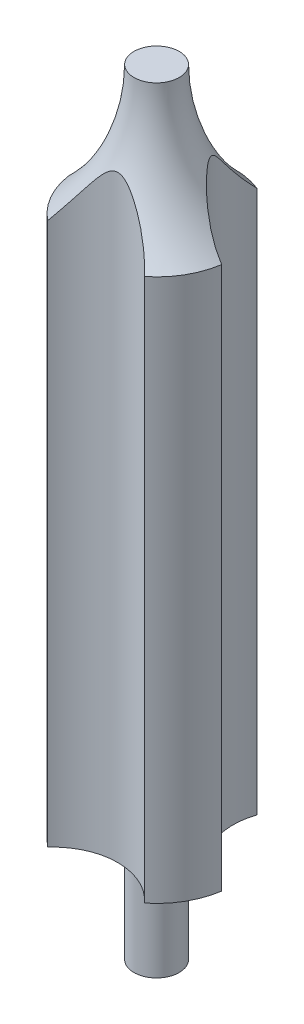
ISO-10303-21;
HEADER;
FILE_DESCRIPTION(('STEP AP214'),'2;1');
FILE_NAME('part.step','',(''),(''),'','','');
FILE_SCHEMA(('AUTOMOTIVE_DESIGN { 1 0 10303 214 1 1 1 1 }'));
ENDSEC;
DATA;
#1=APPLICATION_CONTEXT('core data for automotive mechanical design processes');
#2=APPLICATION_PROTOCOL_DEFINITION('international standard','automotive_design',2000,#1);
#3=PRODUCT_CONTEXT('',#1,'mechanical');
#4=PRODUCT('Part','Part','',(#3));
#5=PRODUCT_RELATED_PRODUCT_CATEGORY('part','',(#4));
#6=PRODUCT_DEFINITION_FORMATION('','',#4);
#7=PRODUCT_DEFINITION_CONTEXT('part definition',#1,'design');
#8=PRODUCT_DEFINITION('design','',#6,#7);
#9=PRODUCT_DEFINITION_SHAPE('','',#8);
#10=(LENGTH_UNIT() NAMED_UNIT(*) SI_UNIT(.MILLI.,.METRE.));
#11=(NAMED_UNIT(*) PLANE_ANGLE_UNIT() SI_UNIT($,.RADIAN.));
#12=(NAMED_UNIT(*) SI_UNIT($,.STERADIAN.) SOLID_ANGLE_UNIT());
#13=UNCERTAINTY_MEASURE_WITH_UNIT(LENGTH_MEASURE(1.E-05),#10,'distance_accuracy_value','');
#14=(GEOMETRIC_REPRESENTATION_CONTEXT(3) GLOBAL_UNCERTAINTY_ASSIGNED_CONTEXT((#13)) GLOBAL_UNIT_ASSIGNED_CONTEXT((#10,
#11,#12)) REPRESENTATION_CONTEXT('',''));
#15=CARTESIAN_POINT('',(0.,0.,0.));
#16=DIRECTION('',(0.,0.,1.));
#17=DIRECTION('',(1.,0.,0.));
#18=AXIS2_PLACEMENT_3D('',#15,#16,#17);
#19=CARTESIAN_POINT('',(0.,18.1736311229692,0.));
#20=DIRECTION('',(0.,1.,0.));
#21=DIRECTION('',(-1.,0.,0.));
#22=AXIS2_PLACEMENT_3D('',#19,#20,#21);
#23=CYLINDRICAL_SURFACE('',#22,3.);
#24=DIRECTION('',(0.,1.,0.));
#25=VECTOR('',#24,1.);
#26=CARTESIAN_POINT('',(1.87265478332233,3.17363712296916,2.34375));
#27=LINE('',#26,#25);
#28=CARTESIAN_POINT('',(1.87265478332233,-7.82636887703084,2.34375));
#29=VERTEX_POINT('',#28);
#30=CARTESIAN_POINT('',(1.87265478332233,13.1736311229692,2.34375));
#31=VERTEX_POINT('',#30);
#32=EDGE_CURVE('E130',#29,#31,#27,.T.);
#33=ORIENTED_EDGE('',*,*,#32,.F.);
#34=CARTESIAN_POINT('',(0.,-7.82636887703084,0.));
#35=DIRECTION('',(0.,1.,0.));
#36=DIRECTION('',(-1.,0.,0.));
#37=AXIS2_PLACEMENT_3D('',#34,#35,#36);
#38=CIRCLE('',#37,3.);
#39=CARTESIAN_POINT('',(2.96607443178095,-7.82636887703084,0.449891614875567));
#40=VERTEX_POINT('',#39);
#41=EDGE_CURVE('E115',#29,#40,#38,.T.);
#42=ORIENTED_EDGE('',*,*,#41,.T.);
#43=DIRECTION('',(0.,1.,0.));
#44=VECTOR('',#43,1.);
#45=CARTESIAN_POINT('',(2.96607443178095,3.17363712296916,0.449891614875567));
#46=LINE('',#45,#44);
#47=CARTESIAN_POINT('',(2.96607443178094,13.1736311229692,0.449891614875567));
#48=VERTEX_POINT('',#47);
#49=EDGE_CURVE('E60',#48,#40,#46,.F.);
#50=ORIENTED_EDGE('',*,*,#49,.F.);
#51=CARTESIAN_POINT('',(0.,13.1736311229692,0.));
#52=DIRECTION('',(0.,1.,0.));
#53=DIRECTION('',(-1.,0.,0.));
#54=AXIS2_PLACEMENT_3D('',#51,#52,#53);
#55=CIRCLE('',#54,3.);
#56=EDGE_CURVE('E119',#31,#48,#55,.T.);
#57=ORIENTED_EDGE('',*,*,#56,.F.);
#58=EDGE_LOOP('',(#33,#42,#50,#57));
#59=FACE_BOUND('',#58,.T.);
#60=ADVANCED_FACE('F37',(#59),#23,.T.);
#61=DIRECTION('',(0.,1.,0.));
#62=VECTOR('',#61,1.);
#63=CARTESIAN_POINT('',(1.0934196484586,3.17363712296916,-2.79364161487559));
#64=LINE('',#63,#62);
#65=CARTESIAN_POINT('',(1.0934196484586,-7.82636887703084,-2.79364161487559));
#66=VERTEX_POINT('',#65);
#67=CARTESIAN_POINT('',(1.0934196484586,13.1736311229692,-2.79364161487559));
#68=VERTEX_POINT('',#67);
#69=EDGE_CURVE('E163',#66,#68,#64,.T.);
#70=ORIENTED_EDGE('',*,*,#69,.F.);
#71=CARTESIAN_POINT('',(-1.09341964845862,-7.82636887703084,-2.79364161487558));
#72=VERTEX_POINT('',#71);
#73=EDGE_CURVE('E117',#66,#72,#38,.T.);
#74=ORIENTED_EDGE('',*,*,#73,.T.);
#75=DIRECTION('',(0.,1.,0.));
#76=VECTOR('',#75,1.);
#77=CARTESIAN_POINT('',(-1.09341964845862,3.17363712296916,-2.79364161487558));
#78=LINE('',#77,#76);
#79=CARTESIAN_POINT('',(-1.09341964845862,13.1736311229692,-2.79364161487558));
#80=VERTEX_POINT('',#79);
#81=EDGE_CURVE('E52',#80,#72,#78,.F.);
#82=ORIENTED_EDGE('',*,*,#81,.F.);
#83=EDGE_CURVE('E114',#68,#80,#55,.T.);
#84=ORIENTED_EDGE('',*,*,#83,.F.);
#85=EDGE_LOOP('',(#70,#74,#82,#84));
#86=FACE_BOUND('',#85,.T.);
#87=ADVANCED_FACE('F196',(#86),#23,.T.);
#88=CARTESIAN_POINT('',(0.,18.1736311229692,0.));
#89=DIRECTION('',(0.,1.,0.));
#90=DIRECTION('',(-1.,0.,0.));
#91=AXIS2_PLACEMENT_3D('',#88,#89,#90);
#92=CYLINDRICAL_SURFACE('',#91,0.875000000000003);
#93=CARTESIAN_POINT('',(0.,-11.8263688770308,0.));
#94=DIRECTION('',(0.,1.,0.));
#95=DIRECTION('',(-1.,0.,0.));
#96=AXIS2_PLACEMENT_3D('',#93,#94,#95);
#97=CIRCLE('',#96,0.875);
#98=CARTESIAN_POINT('',(-0.874999999999996,-11.8263688770308,0.));
#99=VERTEX_POINT('',#98);
#100=EDGE_CURVE('E97',#99,#99,#97,.T.);
#101=ORIENTED_EDGE('',*,*,#100,.T.);
#102=EDGE_LOOP('',(#101));
#103=FACE_BOUND('',#102,.T.);
#104=CARTESIAN_POINT('',(0.,-7.82636887703084,0.));
#105=DIRECTION('',(0.,1.,0.));
#106=DIRECTION('',(-1.,0.,0.));
#107=AXIS2_PLACEMENT_3D('',#104,#105,#106);
#108=CIRCLE('',#107,0.875000000000005);
#109=CARTESIAN_POINT('',(-0.875000000000002,-7.82636887703084,0.));
#110=VERTEX_POINT('',#109);
#111=EDGE_CURVE('E123',#110,#110,#108,.T.);
#112=ORIENTED_EDGE('',*,*,#111,.F.);
#113=EDGE_LOOP('',(#112));
#114=FACE_BOUND('',#113,.T.);
#115=ADVANCED_FACE('F200',(#103,#114),#92,.T.);
#116=CARTESIAN_POINT('',(0.,-11.8263688770308,0.));
#117=DIRECTION('',(0.,-1.,0.));
#118=DIRECTION('',(1.,0.,0.));
#119=AXIS2_PLACEMENT_3D('',#116,#117,#118);
#120=PLANE('',#119);
#121=CARTESIAN_POINT('',(0.,-11.8263688770308,0.));
#122=DIRECTION('',(0.,-1.,0.));
#123=DIRECTION('',(1.,0.,0.));
#124=AXIS2_PLACEMENT_3D('',#121,#122,#123);
#125=CIRCLE('',#124,0.5);
#126=CARTESIAN_POINT('',(0.500000000000002,-11.8263688770308,0.));
#127=VERTEX_POINT('',#126);
#128=EDGE_CURVE('E302',#127,#127,#125,.T.);
#129=ORIENTED_EDGE('',*,*,#128,.F.);
#130=EDGE_LOOP('',(#129));
#131=FACE_BOUND('',#130,.T.);
#132=ORIENTED_EDGE('',*,*,#100,.F.);
#133=EDGE_LOOP('',(#132));
#134=FACE_BOUND('',#133,.T.);
#135=ADVANCED_FACE('F211',(#131,#134),#120,.T.);
#136=CARTESIAN_POINT('',(0.,18.1736311229692,0.));
#137=DIRECTION('',(0.,1.,0.));
#138=DIRECTION('',(-1.,0.,0.));
#139=AXIS2_PLACEMENT_3D('',#136,#137,#138);
#140=PLANE('',#139);
#141=CARTESIAN_POINT('',(0.,18.1736311229692,0.));
#142=DIRECTION('',(0.,1.,0.));
#143=DIRECTION('',(-1.,0.,0.));
#144=AXIS2_PLACEMENT_3D('',#141,#142,#143);
#145=CIRCLE('',#144,0.875);
#146=CARTESIAN_POINT('',(-0.875000000000002,18.1736311229692,0.));
#147=VERTEX_POINT('',#146);
#148=EDGE_CURVE('E176',#147,#147,#145,.T.);
#149=ORIENTED_EDGE('',*,*,#148,.T.);
#150=EDGE_LOOP('',(#149));
#151=FACE_BOUND('',#150,.T.);
#152=ADVANCED_FACE('F206',(#151),#140,.T.);
#153=CARTESIAN_POINT('',(0.,18.1970519709332,0.));
#154=DIRECTION('',(0.,1.,0.));
#155=DIRECTION('',(-1.,0.,0.));
#156=AXIS2_PLACEMENT_3D('',#153,#154,#155);
#157=TOROIDAL_SURFACE('',#156,7.87496081873896,7.);
#158=ORIENTED_EDGE('',*,*,#148,.F.);
#159=EDGE_LOOP('',(#158));
#160=FACE_BOUND('',#159,.T.);
#161=CARTESIAN_POINT('',(-2.96607443178094,13.1736311229692,0.449891614875589));
#162=VERTEX_POINT('',#161);
#163=CARTESIAN_POINT('',(-1.87265478332233,13.1736311229692,2.34375));
#164=VERTEX_POINT('',#163);
#165=EDGE_CURVE('E106',#162,#164,#55,.T.);
#166=ORIENTED_EDGE('',*,*,#165,.T.);
#167=CARTESIAN_POINT('',(-1.87279148834935,13.1734311229691,2.34390457969166));
#168=CARTESIAN_POINT('',(-1.84168791419111,13.2189297558518,2.30873395479843));
#169=CARTESIAN_POINT('',(-1.81000695040931,13.2650455516065,2.27490072332095));
#170=CARTESIAN_POINT('',(-1.74567385393712,13.3583895636435,2.20982773387895));
#171=CARTESIAN_POINT('',(-1.71302202254241,13.4056174338809,2.17858718248888));
#172=CARTESIAN_POINT('',(-1.61396895890166,13.5486661127812,2.08870384040498));
#173=CARTESIAN_POINT('',(-1.54636290678259,13.6460078763119,2.03378007268825));
#174=CARTESIAN_POINT('',(-1.40965214341558,13.8425581428202,1.93360590310212));
#175=CARTESIAN_POINT('',(-1.34057298818892,13.9417331374487,1.88825323730042));
#176=CARTESIAN_POINT('',(-1.20033983089158,14.1419306220951,1.80549989897855));
#177=CARTESIAN_POINT('',(-1.12918550631041,14.2429533983649,1.76810047007298));
#178=CARTESIAN_POINT('',(-1.01679054306838,14.3995229453104,1.71569383480251));
#179=CARTESIAN_POINT('',(-0.976565468611379,14.4549862632391,1.69820601001453));
#180=CARTESIAN_POINT('',(-0.894867987468231,14.5656147108565,1.66522879217567));
#181=CARTESIAN_POINT('',(-0.853395325487044,14.6207797767513,1.64973981162791));
#182=CARTESIAN_POINT('',(-0.768301017183521,14.7306469562195,1.620556063431));
#183=CARTESIAN_POINT('',(-0.724664974101493,14.785341962385,1.60687644777913));
#184=CARTESIAN_POINT('',(-0.634582907108512,14.8928051164561,1.58142476962931));
#185=CARTESIAN_POINT('',(-0.588139613257608,14.9455750588673,1.56965089351742));
#186=CARTESIAN_POINT('',(-0.514634774664298,15.0221542495483,1.55341310490626));
#187=CARTESIAN_POINT('',(-0.489282976047146,15.0474355612788,1.54820326081601));
#188=CARTESIAN_POINT('',(-0.437034188987936,15.096452918467,1.53835227399683));
#189=CARTESIAN_POINT('',(-0.410138273502746,15.1201900130611,1.53371074322578));
#190=CARTESIAN_POINT('',(-0.354642994173274,15.1651184886637,1.52512444596546));
#191=CARTESIAN_POINT('',(-0.326064787487499,15.1863342576709,1.52117279463073));
#192=CARTESIAN_POINT('',(-0.266534578162435,15.2252164360391,1.51406880083951));
#193=CARTESIAN_POINT('',(-0.23559018110598,15.2428936072494,1.51091402695249));
#194=CARTESIAN_POINT('',(-0.17791328759288,15.2696214335115,1.50620891651343));
#195=CARTESIAN_POINT('',(-0.151690159942641,15.2797078552677,1.50445988894649));
#196=CARTESIAN_POINT('',(-0.0978753847906424,15.295303226175,1.50177228962354));
#197=CARTESIAN_POINT('',(-0.0702866332103793,15.3008214560549,1.5008320745329));
#198=CARTESIAN_POINT('',(-0.0142754136517339,15.3063914931008,1.49988304948893));
#199=CARTESIAN_POINT('',(0.0141521985218801,15.3063956526008,1.49988235805775));
#200=CARTESIAN_POINT('',(0.0704498109312545,15.3008133342423,1.50083344207367));
#201=CARTESIAN_POINT('',(0.0983188401450211,15.2952178590679,1.50178675037733));
#202=CARTESIAN_POINT('',(0.157689011387603,15.2779166984957,1.50476886190062));
#203=CARTESIAN_POINT('',(0.188895323823397,15.2652643781759,1.50696539163204));
#204=CARTESIAN_POINT('',(0.248964668580153,15.2354399211681,1.51224364179743));
#205=CARTESIAN_POINT('',(0.27782182998572,15.2182568894852,1.51532749763662));
#206=CARTESIAN_POINT('',(0.343099508395626,15.1744527336863,1.5233669015715));
#207=CARTESIAN_POINT('',(0.378659481738859,15.1466276594519,1.52860037786691));
#208=CARTESIAN_POINT('',(0.446970036598267,15.0878564145683,1.54003714379264));
#209=CARTESIAN_POINT('',(0.479713858166411,15.0569031016983,1.54624267135285));
#210=CARTESIAN_POINT('',(0.543372211513685,14.992869315235,1.55954697991969));
#211=CARTESIAN_POINT('',(0.574270028742408,14.9597738160309,1.56665250461273));
#212=CARTESIAN_POINT('',(0.634487622041539,14.8924300877752,1.5816565568887));
#213=CARTESIAN_POINT('',(0.663809006819957,14.8581830941369,1.58955425154873));
#214=CARTESIAN_POINT('',(0.74069092193397,14.7656302581617,1.6117175403507));
#215=CARTESIAN_POINT('',(0.787236828645713,14.706653676925,1.62668981569411));
#216=CARTESIAN_POINT('',(0.878368721870609,14.587796380378,1.65888995012411));
#217=CARTESIAN_POINT('',(0.922954013245691,14.5279153543455,1.67611860073399));
#218=CARTESIAN_POINT('',(1.01086746144209,14.4078322342218,1.71298837204648));
#219=CARTESIAN_POINT('',(1.05419373970759,14.347629804574,1.73263288973361));
#220=CARTESIAN_POINT('',(1.1398857145546,14.2274304255917,1.77448214045318));
#221=CARTESIAN_POINT('',(1.1822513482308,14.1674334899305,1.79668704056956));
#222=CARTESIAN_POINT('',(1.30764317891457,13.9890505062309,1.86710417951834));
#223=CARTESIAN_POINT('',(1.38955797520291,13.87144255783,1.91936591252555));
#224=CARTESIAN_POINT('',(1.55024108244964,13.6404360226971,2.03618336990147));
#225=CARTESIAN_POINT('',(1.62901386697639,13.5270314687758,2.10072080099379));
#226=CARTESIAN_POINT('',(1.7340748231391,13.3751582296195,2.19874760957119));
#227=CARTESIAN_POINT('',(1.76234208439822,13.3342305517134,2.22637472717458));
#228=CARTESIAN_POINT('',(1.81815086128756,13.2531893028696,2.28362953238699));
#229=CARTESIAN_POINT('',(1.84569141871069,13.2130768214067,2.31325969416506));
#230=CARTESIAN_POINT('',(1.87279148834934,13.1734311229691,2.34390457969166));
#231=B_SPLINE_CURVE_WITH_KNOTS('',3,(#167,#168,#169,#170,#171,#172,#173,#174,#175,#176,#177,
#178,#179,#180,#181,#182,#183,#184,#185,#186,#187,#188,#189,#190,#191,#192,#193,#194,#195,#196,
#197,#198,#199,#200,#201,#202,#203,#204,#205,#206,#207,#208,#209,#210,#211,#212,#213,#214,#215,
#216,#217,#218,#219,#220,#221,#222,#223,#224,#225,#226,#227,#228,#229,#230),.UNSPECIFIED.,.F.,
.F.,(4,2,2,2,2,2,2,2,2,2,2,2,2,2,2,2,2,2,2,2,2,2,2,2,2,2,2,2,2,2,2,4),(0.,0.196094940739122,
0.392129648475782,0.78353039750454,1.17050979811252,1.55754966466079,1.7696538430935,
1.98180172387871,2.19562672240946,2.40924702062951,2.51773921319612,2.62615690965359,
2.73342163296364,2.84035500561147,2.92448075833779,3.00843517900155,3.09311505401682,
3.17793120878399,3.27860152040101,3.37951615721427,3.51553194432585,3.65186560883774,
3.78928905196963,3.92656948717997,4.15629823291934,4.38610778310565,4.61624424788762,
4.84639573928839,5.30355716395833,5.76004258850016,5.93069776854791,6.10156773653594),.UNSPECIFIED.);
#232=EDGE_CURVE('E127',#164,#31,#231,.T.);
#233=ORIENTED_EDGE('',*,*,#232,.T.);
#234=ORIENTED_EDGE('',*,*,#56,.T.);
#235=CARTESIAN_POINT('',(2.96627665423432,13.1734311229692,0.449932715055951));
#236=CARTESIAN_POINT('',(2.92026621253069,13.2189297558519,0.440581542133034));
#237=CARTESIAN_POINT('',(2.87512529268817,13.2650455516066,0.430061638420365));
#238=CARTESIAN_POINT('',(2.7866038824951,13.3583895636435,0.406884037292332));
#239=CARTESIAN_POINT('',(2.74322285566572,13.405617433881,0.39422699751946));
#240=CARTESIAN_POINT('',(2.61585506622363,13.5486661127813,0.353386199125846));
#241=CARTESIAN_POINT('',(2.53448666204986,13.6460078763119,0.322299524399521));
#242=CARTESIAN_POINT('',(2.37937790470175,13.8425581428203,0.253991615145989));
#243=CARTESIAN_POINT('',(2.30556176637481,13.9417331374487,0.216843644748585));
#244=CARTESIAN_POINT('',(2.16377869449143,14.1419306220951,0.136774837237122));
#245=CARTESIAN_POINT('',(2.09581267668159,14.242953398365,0.0938530990134838));
#246=CARTESIAN_POINT('',(1.99422971758948,14.3995229453104,0.022719523223714));
#247=CARTESIAN_POINT('',(1.95897227983766,14.4549862632391,-0.00337250073118608));
#248=CARTESIAN_POINT('',(1.8895644308715,14.5656147108565,-0.0576359859069207));
#249=CARTESIAN_POINT('',(1.85541424924782,14.6207797767514,-0.0858078744713134));
#250=CARTESIAN_POINT('',(1.78759322777989,14.7306469562195,-0.144909833081177));
#251=CARTESIAN_POINT('',(1.75392831157035,14.785341962385,-0.17585994708491));
#252=CARTESIAN_POINT('',(1.68684547822716,14.8928051164561,-0.241147466451337));
#253=CARTESIAN_POINT('',(1.65342735548781,14.9455750588674,-0.275481600705705));
#254=CARTESIAN_POINT('',(1.6026125987526,15.0221542495484,-0.331019763923007));
#255=CARTESIAN_POINT('',(1.58542484211211,15.0474355612789,-0.350370143511959));
#256=CARTESIAN_POINT('',(1.55076924374475,15.096452918467,-0.390693427012572));
#257=CARTESIAN_POINT('',(1.53330160244198,15.1201900130611,-0.411665207695265));
#258=CARTESIAN_POINT('',(1.49811801122536,15.1651184886637,-0.455432380754541));
#259=CARTESIAN_POINT('',(1.48040667743969,15.1863342576709,-0.478206008071661));
#260=CARTESIAN_POINT('',(1.44448933368564,15.2252164360391,-0.526208684744167));
#261=CARTESIAN_POINT('',(1.42628502082806,15.2428936072494,-0.551429931756344));
#262=CARTESIAN_POINT('',(1.39337182890367,15.2696214335115,-0.599027031530531));
#263=CARTESIAN_POINT('',(1.37874556277366,15.2797078552677,-0.620862412458847));
#264=CARTESIAN_POINT('',(1.34951064590879,15.2953032261751,-0.666123575177955));
#265=CARTESIAN_POINT('',(1.33490201996514,15.3008214560549,-0.689546027359844));
#266=CARTESIAN_POINT('',(1.30607453038891,15.3063914931008,-0.737578653872594));
#267=CARTESIAN_POINT('',(1.29186012550514,15.3063956526008,-0.762197342468286));
#268=CARTESIAN_POINT('',(1.26453498221937,15.3008133342423,-0.811428046995176));
#269=CARTESIAN_POINT('',(1.2514260568211,15.2952178590679,-0.836039988424937));
#270=CARTESIAN_POINT('',(1.2243235555359,15.2779166984957,-0.888947120709698));
#271=CARTESIAN_POINT('',(1.21062264986558,15.2652643781758,-0.917070844903244));
#272=CARTESIAN_POINT('',(1.18515907621795,15.235439921168,-0.971731548533982));
#273=CARTESIAN_POINT('',(1.17340119301351,15.2182568894852,-0.998264511311907));
#274=CARTESIAN_POINT('',(1.14772468184745,15.1744527336863,-1.05881634108241));
#275=CARTESIAN_POINT('',(1.13447701859775,15.1466276594518,-1.09222891950327));
#276=CARTESIAN_POINT('',(1.11022627099686,15.0878564145681,-1.15710597832102));
#277=CARTESIAN_POINT('',(1.09922850472381,15.0569031016981,-1.18856572339614));
#278=CARTESIAN_POINT('',(1.07892119724885,14.9928693152348,-1.25034762884141));
#279=CARTESIAN_POINT('',(1.06962585352587,14.9597738160307,-1.28065868582951));
#280=CARTESIAN_POINT('',(1.05251094730701,14.892430087775,-1.34031067751932));
#281=CARTESIAN_POINT('',(1.04468985912471,14.8581830941366,-1.3696525889416));
#282=CARTESIAN_POINT('',(1.02544287270163,14.7656302581614,-1.44731592492293));
#283=CARTESIAN_POINT('',(1.01513629014561,14.7066536769247,-1.49511200024918));
#284=CARTESIAN_POINT('',(0.997456477954826,14.5877963803777,-1.59013460209191));
#285=CARTESIAN_POINT('',(0.990084281368372,14.5279153543452,-1.6373609223628));
#286=CARTESIAN_POINT('',(0.978057715858519,14.4078322342215,-1.73193108749142));
#287=CARTESIAN_POINT('',(0.973407228087918,14.3476298045737,-1.77927500396434));
#288=CARTESIAN_POINT('',(0.966803754916916,14.2274304255914,-1.87441105644209));
#289=CARTESIAN_POINT('',(0.9648509456681,14.1674334899302,-1.9222032215113));
#290=CARTESIAN_POINT('',(0.963138061517694,13.9890505062306,-2.06600430178488));
#291=CARTESIAN_POINT('',(0.967440651803577,13.8714425578297,-2.16307546282002));
#292=CARTESIAN_POINT('',(0.988265983873279,13.6404360226968,-2.36063984434268));
#293=CARTESIAN_POINT('',(1.00477064643086,13.5270314687755,-2.46112779241584));
#294=CARTESIAN_POINT('',(1.03713387482944,13.3751582296193,-2.60112665368729));
#295=CARTESIAN_POINT('',(1.04692602987776,13.3342305517132,-2.63942037883475));
#296=CARTESIAN_POINT('',(1.06860575723573,13.2531893028696,-2.71637959998116));
#297=CARTESIAN_POINT('',(1.08049595134221,13.2130768214067,-2.75504550323297));
#298=CARTESIAN_POINT('',(1.09348516588497,13.1734311229692,-2.79383729474762));
#299=B_SPLINE_CURVE_WITH_KNOTS('',3,(#235,#236,#237,#238,#239,#240,#241,#242,#243,#244,#245,
#246,#247,#248,#249,#250,#251,#252,#253,#254,#255,#256,#257,#258,#259,#260,#261,#262,#263,#264,
#265,#266,#267,#268,#269,#270,#271,#272,#273,#274,#275,#276,#277,#278,#279,#280,#281,#282,#283,
#284,#285,#286,#287,#288,#289,#290,#291,#292,#293,#294,#295,#296,#297,#298),.UNSPECIFIED.,.F.,
.F.,(4,2,2,2,2,2,2,2,2,2,2,2,2,2,2,2,2,2,2,2,2,2,2,2,2,2,2,2,2,2,2,4),(0.,0.196094940739124,
0.392129648475788,0.783530397504551,1.17050979811253,1.5575496646608,1.76965384309351,
1.98180172387872,2.19562672240947,2.40924702062953,2.51773921319615,2.62615690965361,
2.73342163296367,2.8403550056115,2.92448075833782,3.00843517900158,3.09311505401685,
3.17793120878402,3.27860152040107,3.37951615721435,3.515531944326,3.65186560883795,
3.78928905196991,3.92656948718031,4.15629823291969,4.386107783106,4.61624424788798,
4.84639573928875,5.3035571639587,5.76004258850054,5.93069776854806,6.10156773653588),.UNSPECIFIED.);
#300=EDGE_CURVE('E165',#48,#68,#299,.T.);
#301=ORIENTED_EDGE('',*,*,#300,.T.);
#302=ORIENTED_EDGE('',*,*,#83,.T.);
#303=CARTESIAN_POINT('',(-1.09348516588499,13.1734311229692,-2.79383729474761));
#304=CARTESIAN_POINT('',(-1.07857829833961,13.2189297558519,-2.74931549693146));
#305=CARTESIAN_POINT('',(-1.06511834227888,13.2650455516066,-2.70496236174131));
#306=CARTESIAN_POINT('',(-1.04093002855801,13.3583895636435,-2.61671177117128));
#307=CARTESIAN_POINT('',(-1.03020083312334,13.405617433881,-2.57281418000834));
#308=CARTESIAN_POINT('',(-1.001886107322,13.5486661127813,-2.44209003953082));
#309=CARTESIAN_POINT('',(-0.988123755267299,13.6460078763119,-2.35607959708777));
#310=CARTESIAN_POINT('',(-0.969725761286203,13.8425581428203,-2.1875975182481));
#311=CARTESIAN_POINT('',(-0.964988778185918,13.9417331374487,-2.105096882049));
#312=CARTESIAN_POINT('',(-0.963438863599881,14.1419306220951,-1.94227473621567));
#313=CARTESIAN_POINT('',(-0.966627170371219,14.242953398365,-1.86195356908646));
#314=CARTESIAN_POINT('',(-0.97743917452113,14.3995229453104,-1.73841335802622));
#315=CARTESIAN_POINT('',(-0.982406811226318,14.4549862632391,-1.69483350928334));
#316=CARTESIAN_POINT('',(-0.994696443403303,14.5656147108565,-1.60759280626875));
#317=CARTESIAN_POINT('',(-1.00201892376081,14.6207797767514,-1.56393193715659));
#318=CARTESIAN_POINT('',(-1.0192922105964,14.7306469562195,-1.47564623034982));
#319=CARTESIAN_POINT('',(-1.02926333746889,14.785341962385,-1.43101650069421));
#320=CARTESIAN_POINT('',(-1.0522625711187,14.8928051164561,-1.34027730317797));
#321=CARTESIAN_POINT('',(-1.06528774223024,14.9455750588674,-1.29416929281172));
#322=CARTESIAN_POINT('',(-1.08797782408835,15.0221542495484,-1.22239334098325));
#323=CARTESIAN_POINT('',(-1.09614186606501,15.0474355612789,-1.19783311730404));
#324=CARTESIAN_POINT('',(-1.11373505475686,15.096452918467,-1.14765884698425));
#325=CARTESIAN_POINT('',(-1.12316332893929,15.1201900130611,-1.12204553553052));
#326=CARTESIAN_POINT('',(-1.14347501705214,15.1651184886637,-1.06969206521091));
#327=CARTESIAN_POINT('',(-1.15434188995225,15.1863342576709,-1.04296678655906));
#328=CARTESIAN_POINT('',(-1.17795475552327,15.2252164360391,-0.987860116095339));
#329=CARTESIAN_POINT('',(-1.19069483972214,15.2428936072494,-0.959484095196148));
#330=CARTESIAN_POINT('',(-1.21545854131086,15.2696214335115,-0.907181884982902));
#331=CARTESIAN_POINT('',(-1.22705540283108,15.2797078552677,-0.883597476487638));
#332=CARTESIAN_POINT('',(-1.25163526111822,15.2953032261751,-0.835648714445585));
#333=CARTESIAN_POINT('',(-1.26461538675484,15.3008214560549,-0.811286047173059));
#334=CARTESIAN_POINT('',(-1.29179911673725,15.3063914931008,-0.762304395616337));
#335=CARTESIAN_POINT('',(-1.30601232402709,15.3063956526008,-0.737685015589466));
#336=CARTESIAN_POINT('',(-1.3349847931507,15.3008133342423,-0.689405395078499));
#337=CARTESIAN_POINT('',(-1.34974489696619,15.2952178590679,-0.665746761952395));
#338=CARTESIAN_POINT('',(-1.38201256692358,15.2779166984957,-0.615821741190931));
#339=CARTESIAN_POINT('',(-1.39951797368906,15.2652643781758,-0.589894546728806));
#340=CARTESIAN_POINT('',(-1.4341237447982,15.235439921168,-0.540512093263458));
#341=CARTESIAN_POINT('',(-1.45122302299933,15.2182568894852,-0.517062986324719));
#342=CARTESIAN_POINT('',(-1.49082419024318,15.1744527336863,-0.464550560489095));
#343=CARTESIAN_POINT('',(-1.51313650033674,15.1466276594518,-0.436371458363653));
#344=CARTESIAN_POINT('',(-1.55719630759529,15.0878564145681,-0.382931165471642));
#345=CARTESIAN_POINT('',(-1.5789423628904,15.0569031016981,-0.357676947956741));
#346=CARTESIAN_POINT('',(-1.62229340876273,14.9928693152348,-0.30919935107832));
#347=CARTESIAN_POINT('',(-1.64389588226849,14.9597738160307,-0.285993818783267));
#348=CARTESIAN_POINT('',(-1.68699856934878,14.892430087775,-0.241345879369432));
#349=CARTESIAN_POINT('',(-1.70849886594491,14.8581830941366,-0.219901662607191));
#350=CARTESIAN_POINT('',(-1.76613379463585,14.7656302581614,-0.164401615427839));
#351=CARTESIAN_POINT('',(-1.80237311879157,14.7066536769247,-0.131577815445001));
#352=CARTESIAN_POINT('',(-1.87582519982567,14.5877963803777,-0.0687553480322781));
#353=CARTESIAN_POINT('',(-1.9130382946143,14.5279153543452,-0.0387576783712694));
#354=CARTESIAN_POINT('',(-1.98892517730085,14.4078322342215,0.0189427154448486));
#355=CARTESIAN_POINT('',(-2.02760096779574,14.3476298045737,0.0466421142306394));
#356=CARTESIAN_POINT('',(-2.10668946947175,14.2274304255914,0.0999289159888114));
#357=CARTESIAN_POINT('',(-2.14710229389913,14.1674334899302,0.125516180941634));
#358=CARTESIAN_POINT('',(-2.2707812404325,13.9890505062306,0.198900122266416));
#359=CARTESIAN_POINT('',(-2.35699862700672,13.8714425578297,0.243709550294334));
#360=CARTESIAN_POINT('',(-2.53850706632315,13.6404360226968,0.324456474441051));
#361=CARTESIAN_POINT('',(-2.63378451340747,13.5270314687755,0.360406991421882));
#362=CARTESIAN_POINT('',(-2.77120869796873,13.3751582296193,0.402379044115951));
#363=CARTESIAN_POINT('',(-2.80926811427613,13.3342305517132,0.413045651660045));
#364=CARTESIAN_POINT('',(-2.88675661852337,13.2531893028696,0.432750067594123));
#365=CARTESIAN_POINT('',(-2.92618737005294,13.2130768214067,0.441785809067886));
#366=CARTESIAN_POINT('',(-2.96627665423431,13.1734311229692,0.449932715055973));
#367=B_SPLINE_CURVE_WITH_KNOTS('',3,(#303,#304,#305,#306,#307,#308,#309,#310,#311,#312,#313,
#314,#315,#316,#317,#318,#319,#320,#321,#322,#323,#324,#325,#326,#327,#328,#329,#330,#331,#332,
#333,#334,#335,#336,#337,#338,#339,#340,#341,#342,#343,#344,#345,#346,#347,#348,#349,#350,#351,
#352,#353,#354,#355,#356,#357,#358,#359,#360,#361,#362,#363,#364,#365,#366),.UNSPECIFIED.,.F.,
.F.,(4,2,2,2,2,2,2,2,2,2,2,2,2,2,2,2,2,2,2,2,2,2,2,2,2,2,2,2,2,2,2,4),(0.,0.196094940739124,
0.392129648475785,0.783530397504546,1.17050979811253,1.5575496646608,1.76965384309351,
1.98180172387872,2.19562672240948,2.40924702062954,2.51773921319614,2.62615690965361,
2.73342163296367,2.8403550056115,2.92448075833782,3.00843517900158,3.09311505401685,
3.17793120878402,3.27860152040107,3.37951615721434,3.51553194432599,3.65186560883795,
3.78928905196991,3.92656948718032,4.1562982329197,4.38610778310601,4.61624424788799,
4.84639573928876,5.30355716395871,5.76004258850055,5.93069776854806,6.10156773653588),.UNSPECIFIED.);
#368=EDGE_CURVE('E107',#80,#162,#367,.T.);
#369=ORIENTED_EDGE('',*,*,#368,.T.);
#370=EDGE_LOOP('',(#166,#233,#234,#301,#302,#369));
#371=FACE_BOUND('',#370,.T.);
#372=ADVANCED_FACE('F139',(#160,#371),#157,.F.);
#373=DIRECTION('',(0.,1.,0.));
#374=VECTOR('',#373,1.);
#375=CARTESIAN_POINT('',(-1.87265478332233,3.17363712296916,2.34375));
#376=LINE('',#375,#374);
#377=CARTESIAN_POINT('',(-1.87265478332233,-7.82636887703084,2.34375));
#378=VERTEX_POINT('',#377);
#379=EDGE_CURVE('E170',#164,#378,#376,.F.);
#380=ORIENTED_EDGE('',*,*,#379,.F.);
#381=ORIENTED_EDGE('',*,*,#165,.F.);
#382=DIRECTION('',(0.,1.,0.));
#383=VECTOR('',#382,1.);
#384=CARTESIAN_POINT('',(-2.96607443178094,3.17363712296916,0.449891614875589));
#385=LINE('',#384,#383);
#386=CARTESIAN_POINT('',(-2.96607443178094,-7.82636887703084,0.44989161487559));
#387=VERTEX_POINT('',#386);
#388=EDGE_CURVE('E90',#387,#162,#385,.T.);
#389=ORIENTED_EDGE('',*,*,#388,.F.);
#390=EDGE_CURVE('E104',#387,#378,#38,.T.);
#391=ORIENTED_EDGE('',*,*,#390,.T.);
#392=EDGE_LOOP('',(#380,#381,#389,#391));
#393=FACE_BOUND('',#392,.T.);
#394=ADVANCED_FACE('F103',(#393),#23,.T.);
#395=CARTESIAN_POINT('',(0.,-7.82636887703084,0.));
#396=DIRECTION('',(0.,-1.,0.));
#397=DIRECTION('',(1.,0.,0.));
#398=AXIS2_PLACEMENT_3D('',#395,#396,#397);
#399=PLANE('',#398);
#400=CARTESIAN_POINT('',(0.,-7.82636887703084,4.));
#401=DIRECTION('',(0.,-1.,0.));
#402=DIRECTION('',(1.,0.,0.));
#403=AXIS2_PLACEMENT_3D('',#400,#401,#402);
#404=CIRCLE('',#403,2.5);
#405=EDGE_CURVE('E113',#378,#29,#404,.T.);
#406=ORIENTED_EDGE('',*,*,#405,.F.);
#407=ORIENTED_EDGE('',*,*,#390,.F.);
#408=CARTESIAN_POINT('',(-3.46410161513776,-7.82636887703084,-1.99999999999999));
#409=DIRECTION('',(0.,-1.,0.));
#410=DIRECTION('',(1.,0.,0.));
#411=AXIS2_PLACEMENT_3D('',#408,#409,#410);
#412=CIRCLE('',#411,2.5);
#413=EDGE_CURVE('E87',#72,#387,#412,.T.);
#414=ORIENTED_EDGE('',*,*,#413,.F.);
#415=ORIENTED_EDGE('',*,*,#73,.F.);
#416=CARTESIAN_POINT('',(3.46410161513775,-7.82636887703084,-2.00000000000002));
#417=DIRECTION('',(0.,-1.,0.));
#418=DIRECTION('',(1.,0.,0.));
#419=AXIS2_PLACEMENT_3D('',#416,#417,#418);
#420=CIRCLE('',#419,2.5);
#421=EDGE_CURVE('E96',#40,#66,#420,.T.);
#422=ORIENTED_EDGE('',*,*,#421,.F.);
#423=ORIENTED_EDGE('',*,*,#41,.F.);
#424=EDGE_LOOP('',(#406,#407,#414,#415,#422,#423));
#425=FACE_BOUND('',#424,.T.);
#426=ORIENTED_EDGE('',*,*,#111,.T.);
#427=EDGE_LOOP('',(#426));
#428=FACE_BOUND('',#427,.T.);
#429=ADVANCED_FACE('F110',(#425,#428),#399,.T.);
#430=CARTESIAN_POINT('',(-3.46410161513776,-11.8263688770308,-1.99999999999999));
#431=DIRECTION('',(0.,1.,0.));
#432=DIRECTION('',(-1.,0.,0.));
#433=AXIS2_PLACEMENT_3D('',#430,#431,#432);
#434=CYLINDRICAL_SURFACE('',#433,2.5);
#435=ORIENTED_EDGE('',*,*,#81,.T.);
#436=ORIENTED_EDGE('',*,*,#413,.T.);
#437=ORIENTED_EDGE('',*,*,#388,.T.);
#438=ORIENTED_EDGE('',*,*,#368,.F.);
#439=EDGE_LOOP('',(#435,#436,#437,#438));
#440=FACE_BOUND('',#439,.T.);
#441=ADVANCED_FACE('F89',(#440),#434,.F.);
#442=CARTESIAN_POINT('',(3.46410161513775,-11.8263688770308,-2.00000000000002));
#443=DIRECTION('',(0.,1.,0.));
#444=DIRECTION('',(-1.,0.,0.));
#445=AXIS2_PLACEMENT_3D('',#442,#443,#444);
#446=CYLINDRICAL_SURFACE('',#445,2.5);
#447=ORIENTED_EDGE('',*,*,#49,.T.);
#448=ORIENTED_EDGE('',*,*,#421,.T.);
#449=ORIENTED_EDGE('',*,*,#69,.T.);
#450=ORIENTED_EDGE('',*,*,#300,.F.);
#451=EDGE_LOOP('',(#447,#448,#449,#450));
#452=FACE_BOUND('',#451,.T.);
#453=ADVANCED_FACE('F149',(#452),#446,.F.);
#454=CARTESIAN_POINT('',(0.,-11.8263688770308,4.));
#455=DIRECTION('',(0.,1.,0.));
#456=DIRECTION('',(-1.,0.,0.));
#457=AXIS2_PLACEMENT_3D('',#454,#455,#456);
#458=CYLINDRICAL_SURFACE('',#457,2.5);
#459=ORIENTED_EDGE('',*,*,#379,.T.);
#460=ORIENTED_EDGE('',*,*,#405,.T.);
#461=ORIENTED_EDGE('',*,*,#32,.T.);
#462=ORIENTED_EDGE('',*,*,#232,.F.);
#463=EDGE_LOOP('',(#459,#460,#461,#462));
#464=FACE_BOUND('',#463,.T.);
#465=ADVANCED_FACE('F143',(#464),#458,.F.);
#466=CARTESIAN_POINT('',(0.,-9.82636887703084,0.));
#467=DIRECTION('',(0.,-1.,0.));
#468=DIRECTION('',(1.,0.,0.));
#469=AXIS2_PLACEMENT_3D('',#466,#467,#468);
#470=CYLINDRICAL_SURFACE('',#469,0.5);
#471=CARTESIAN_POINT('',(0.,-10.3163688770308,0.));
#472=DIRECTION('',(0.,-1.,0.));
#473=DIRECTION('',(1.,0.,0.));
#474=AXIS2_PLACEMENT_3D('',#471,#472,#473);
#475=CIRCLE('',#474,0.5);
#476=CARTESIAN_POINT('',(0.500000000000001,-10.3163688770308,0.));
#477=VERTEX_POINT('',#476);
#478=EDGE_CURVE('E11',#477,#477,#475,.F.);
#479=ORIENTED_EDGE('',*,*,#478,.T.);
#480=EDGE_LOOP('',(#479));
#481=FACE_BOUND('',#480,.T.);
#482=ORIENTED_EDGE('',*,*,#128,.T.);
#483=EDGE_LOOP('',(#482));
#484=FACE_BOUND('',#483,.T.);
#485=ADVANCED_FACE('F148',(#481,#484),#470,.F.);
#486=CARTESIAN_POINT('',(0.,-9.82636887703084,0.));
#487=DIRECTION('',(0.,-1.,0.));
#488=DIRECTION('',(1.,0.,0.));
#489=AXIS2_PLACEMENT_3D('',#486,#487,#488);
#490=PLANE('',#489);
#491=CARTESIAN_POINT('',(0.,-9.82636887703084,0.));
#492=DIRECTION('',(0.,-1.,0.));
#493=DIRECTION('',(1.,0.,0.));
#494=AXIS2_PLACEMENT_3D('',#491,#492,#493);
#495=CIRCLE('',#494,0.00999999999999959);
#496=CARTESIAN_POINT('',(0.0100000000000006,-9.82636887703084,0.));
#497=VERTEX_POINT('',#496);
#498=EDGE_CURVE('E45',#497,#497,#495,.T.);
#499=ORIENTED_EDGE('',*,*,#498,.T.);
#500=EDGE_LOOP('',(#499));
#501=FACE_BOUND('',#500,.T.);
#502=ADVANCED_FACE('F186',(#501),#490,.T.);
#503=CARTESIAN_POINT('',(0.,-9.82636887703084,0.));
#504=DIRECTION('',(0.,-1.,0.));
#505=DIRECTION('',(1.,0.,0.));
#506=AXIS2_PLACEMENT_3D('',#503,#504,#505);
#507=CONICAL_SURFACE('',#506,0.00999999999999959,0.78539816339745);
#508=CARTESIAN_POINT('',(0.500000000000001,-10.3163688770308,0.));
#509=CARTESIAN_POINT('',(0.494895833333335,-10.3112647103642,0.));
#510=CARTESIAN_POINT('',(0.489791666666668,-10.3061605436975,0.));
#511=CARTESIAN_POINT('',(0.479583333333334,-10.2959522103642,0.));
#512=CARTESIAN_POINT('',(0.474479166666668,-10.2908480436975,0.));
#513=CARTESIAN_POINT('',(0.464270833333334,-10.2806397103642,0.));
#514=CARTESIAN_POINT('',(0.459166666666668,-10.2755355436975,0.));
#515=CARTESIAN_POINT('',(0.448958333333334,-10.2653272103642,0.));
#516=CARTESIAN_POINT('',(0.443854166666668,-10.2602230436975,0.));
#517=CARTESIAN_POINT('',(0.433645833333334,-10.2500147103642,0.));
#518=CARTESIAN_POINT('',(0.428541666666668,-10.2449105436975,0.));
#519=CARTESIAN_POINT('',(0.418333333333334,-10.2347022103642,0.));
#520=CARTESIAN_POINT('',(0.413229166666667,-10.2295980436975,0.));
#521=CARTESIAN_POINT('',(0.403020833333334,-10.2193897103642,0.));
#522=CARTESIAN_POINT('',(0.397916666666668,-10.2142855436975,0.));
#523=CARTESIAN_POINT('',(0.387708333333334,-10.2040772103642,0.));
#524=CARTESIAN_POINT('',(0.382604166666668,-10.1989730436975,0.));
#525=CARTESIAN_POINT('',(0.372395833333334,-10.1887647103642,0.));
#526=CARTESIAN_POINT('',(0.367291666666668,-10.1836605436975,0.));
#527=CARTESIAN_POINT('',(0.357083333333334,-10.1734522103642,0.));
#528=CARTESIAN_POINT('',(0.351979166666668,-10.1683480436975,0.));
#529=CARTESIAN_POINT('',(0.341770833333334,-10.1581397103642,0.));
#530=CARTESIAN_POINT('',(0.336666666666668,-10.1530355436975,0.));
#531=CARTESIAN_POINT('',(0.326458333333334,-10.1428272103642,0.));
#532=CARTESIAN_POINT('',(0.321354166666667,-10.1377230436975,0.));
#533=CARTESIAN_POINT('',(0.311145833333334,-10.1275147103642,0.));
#534=CARTESIAN_POINT('',(0.306041666666668,-10.1224105436975,0.));
#535=CARTESIAN_POINT('',(0.295833333333334,-10.1122022103642,0.));
#536=CARTESIAN_POINT('',(0.290729166666668,-10.1070980436975,0.));
#537=CARTESIAN_POINT('',(0.280520833333334,-10.0968897103642,0.));
#538=CARTESIAN_POINT('',(0.275416666666668,-10.0917855436975,0.));
#539=CARTESIAN_POINT('',(0.265208333333334,-10.0815772103642,0.));
#540=CARTESIAN_POINT('',(0.260104166666667,-10.0764730436975,0.));
#541=CARTESIAN_POINT('',(0.249895833333334,-10.0662647103642,0.));
#542=CARTESIAN_POINT('',(0.244791666666668,-10.0611605436975,0.));
#543=CARTESIAN_POINT('',(0.234583333333334,-10.0509522103642,0.));
#544=CARTESIAN_POINT('',(0.229479166666668,-10.0458480436975,0.));
#545=CARTESIAN_POINT('',(0.219270833333334,-10.0356397103642,0.));
#546=CARTESIAN_POINT('',(0.214166666666667,-10.0305355436975,0.));
#547=CARTESIAN_POINT('',(0.203958333333334,-10.0203272103642,0.));
#548=CARTESIAN_POINT('',(0.198854166666668,-10.0152230436975,0.));
#549=CARTESIAN_POINT('',(0.188645833333334,-10.0050147103642,0.));
#550=CARTESIAN_POINT('',(0.183541666666667,-9.99991054369751,0.));
#551=CARTESIAN_POINT('',(0.173333333333334,-9.98970221036417,0.));
#552=CARTESIAN_POINT('',(0.168229166666667,-9.98459804369751,0.));
#553=CARTESIAN_POINT('',(0.158020833333334,-9.97438971036417,0.));
#554=CARTESIAN_POINT('',(0.152916666666667,-9.96928554369751,0.));
#555=CARTESIAN_POINT('',(0.142708333333334,-9.95907721036417,0.));
#556=CARTESIAN_POINT('',(0.137604166666667,-9.95397304369751,0.));
#557=CARTESIAN_POINT('',(0.127395833333334,-9.94376471036417,0.));
#558=CARTESIAN_POINT('',(0.122291666666667,-9.93866054369751,0.));
#559=CARTESIAN_POINT('',(0.112083333333334,-9.92845221036417,0.));
#560=CARTESIAN_POINT('',(0.106979166666667,-9.92334804369751,0.));
#561=CARTESIAN_POINT('',(0.0967708333333342,-9.91313971036417,0.));
#562=CARTESIAN_POINT('',(0.0916666666666674,-9.90803554369751,0.));
#563=CARTESIAN_POINT('',(0.0814583333333339,-9.89782721036417,0.));
#564=CARTESIAN_POINT('',(0.0763541666666673,-9.89272304369751,0.));
#565=CARTESIAN_POINT('',(0.066145833333334,-9.88251471036417,0.));
#566=CARTESIAN_POINT('',(0.0610416666666673,-9.87741054369751,0.));
#567=CARTESIAN_POINT('',(0.0508333333333339,-9.86720221036417,0.));
#568=CARTESIAN_POINT('',(0.0457291666666673,-9.86209804369751,0.));
#569=CARTESIAN_POINT('',(0.0355208333333339,-9.85188971036417,0.));
#570=CARTESIAN_POINT('',(0.0304166666666672,-9.84678554369751,0.));
#571=CARTESIAN_POINT('',(0.0202083333333337,-9.83657721036417,0.));
#572=CARTESIAN_POINT('',(0.015104166666667,-9.83147304369751,0.));
#573=CARTESIAN_POINT('',(0.0100000000000006,-9.82636887703084,0.));
#574=B_SPLINE_CURVE_WITH_KNOTS('',3,(#508,#509,#510,#511,#512,#513,#514,#515,#516,#517,#518,
#519,#520,#521,#522,#523,#524,#525,#526,#527,#528,#529,#530,#531,#532,#533,#534,#535,#536,#537,
#538,#539,#540,#541,#542,#543,#544,#545,#546,#547,#548,#549,#550,#551,#552,#553,#554,#555,#556,
#557,#558,#559,#560,#561,#562,#563,#564,#565,#566,#567,#568,#569,#570,#571,#572,#573),
.UNSPECIFIED.,.F.,.F.,(4,2,2,2,2,2,2,2,2,2,2,2,2,2,2,2,2,2,2,2,2,2,2,2,2,2,2,2,2,2,2,2,4),(0.,
0.0216551451738391,0.0433102903476768,0.0649654355215147,0.0866205806953525,0.10827572586919,
0.129930871043028,0.151586016216867,0.173241161390705,0.194896306564543,0.216551451738381,
0.238206596912218,0.259861742086056,0.281516887259895,0.303172032433733,0.324827177607571,
0.346482322781409,0.368137467955247,0.389792613129084,0.411447758302922,0.433102903476761,
0.454758048650599,0.476413193824437,0.498068338998275,0.519723484172112,0.54137862934595,
0.563033774519789,0.584688919693627,0.606344064867465,0.627999210041303,0.64965435521514,
0.671309500388978,0.692964645562817),.UNSPECIFIED.);
#575=EDGE_CURVE('BSEAM39',#477,#497,#574,.T.);
#576=ORIENTED_EDGE('',*,*,#478,.F.);
#577=ORIENTED_EDGE('',*,*,#498,.F.);
#578=ORIENTED_EDGE('',*,*,#575,.T.);
#579=ORIENTED_EDGE('',*,*,#575,.F.);
#580=EDGE_LOOP('',(#576,#578,#577,#579));
#581=FACE_BOUND('',#580,.T.);
#582=ADVANCED_FACE('F39',(#581),#507,.F.);
#583=CLOSED_SHELL('',(#60,#87,#115,#135,#152,#372,#394,#429,#441,#453,#465,#485,#502,#582));
#584=MANIFOLD_SOLID_BREP('B2',#583);
#585=ADVANCED_BREP_SHAPE_REPRESENTATION('',(#18,#584),#14);
#586=SHAPE_DEFINITION_REPRESENTATION(#9,#585);
ENDSEC;
END-ISO-10303-21;
